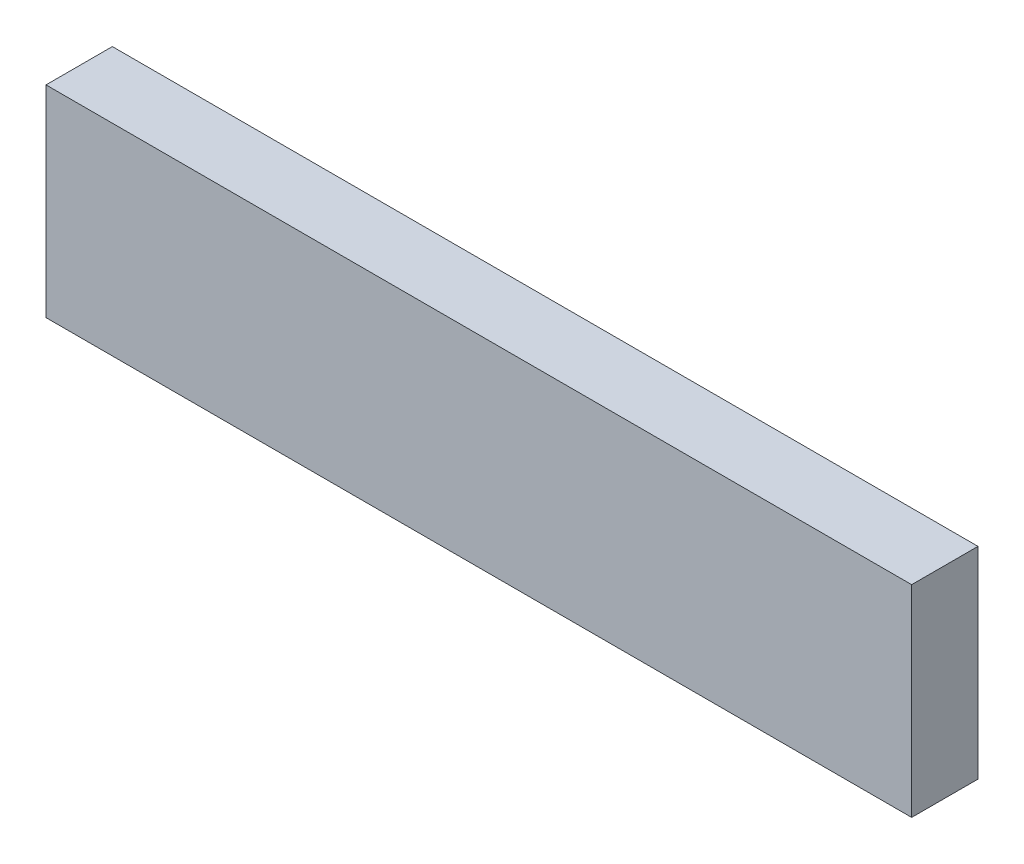
ISO-10303-21;
HEADER;
FILE_DESCRIPTION(('STEP AP214'),'2;1');
FILE_NAME('part.step','',(''),(''),'','','');
FILE_SCHEMA(('AUTOMOTIVE_DESIGN { 1 0 10303 214 1 1 1 1 }'));
ENDSEC;
DATA;
#1=APPLICATION_CONTEXT('core data for automotive mechanical design processes');
#2=APPLICATION_PROTOCOL_DEFINITION('international standard','automotive_design',2000,#1);
#3=PRODUCT_CONTEXT('',#1,'mechanical');
#4=PRODUCT('Part','Part','',(#3));
#5=PRODUCT_RELATED_PRODUCT_CATEGORY('part','',(#4));
#6=PRODUCT_DEFINITION_FORMATION('','',#4);
#7=PRODUCT_DEFINITION_CONTEXT('part definition',#1,'design');
#8=PRODUCT_DEFINITION('design','',#6,#7);
#9=PRODUCT_DEFINITION_SHAPE('','',#8);
#10=(LENGTH_UNIT() NAMED_UNIT(*) SI_UNIT(.MILLI.,.METRE.));
#11=(NAMED_UNIT(*) PLANE_ANGLE_UNIT() SI_UNIT($,.RADIAN.));
#12=(NAMED_UNIT(*) SI_UNIT($,.STERADIAN.) SOLID_ANGLE_UNIT());
#13=UNCERTAINTY_MEASURE_WITH_UNIT(LENGTH_MEASURE(1.E-05),#10,'distance_accuracy_value','');
#14=(GEOMETRIC_REPRESENTATION_CONTEXT(3) GLOBAL_UNCERTAINTY_ASSIGNED_CONTEXT((#13)) GLOBAL_UNIT_ASSIGNED_CONTEXT((#10,
#11,#12)) REPRESENTATION_CONTEXT('',''));
#15=CARTESIAN_POINT('',(0.,0.,0.));
#16=DIRECTION('',(0.,0.,1.));
#17=DIRECTION('',(1.,0.,0.));
#18=AXIS2_PLACEMENT_3D('',#15,#16,#17);
#19=CARTESIAN_POINT('',(65.2365462790918,-15.1923261202123,10.));
#20=DIRECTION('',(-1.,0.,0.));
#21=DIRECTION('',(0.,0.,1.));
#22=AXIS2_PLACEMENT_3D('',#19,#20,#21);
#23=PLANE('',#22);
#24=DIRECTION('',(0.,1.,0.));
#25=VECTOR('',#24,1.);
#26=CARTESIAN_POINT('',(65.2365462790918,-15.1923261202123,0.));
#27=LINE('',#26,#25);
#28=CARTESIAN_POINT('',(65.2365462790918,-15.1923261202123,0.));
#29=VERTEX_POINT('',#28);
#30=CARTESIAN_POINT('',(65.2365462790918,15.1923261202123,0.));
#31=VERTEX_POINT('',#30);
#32=EDGE_CURVE('E111',#29,#31,#27,.T.);
#33=ORIENTED_EDGE('',*,*,#32,.T.);
#34=DIRECTION('',(0.,0.,-1.));
#35=VECTOR('',#34,1.);
#36=CARTESIAN_POINT('',(65.2365462790918,15.1923261202123,10.));
#37=LINE('',#36,#35);
#38=CARTESIAN_POINT('',(65.2365462790918,15.1923261202123,10.));
#39=VERTEX_POINT('',#38);
#40=EDGE_CURVE('E11',#39,#31,#37,.T.);
#41=ORIENTED_EDGE('',*,*,#40,.F.);
#42=DIRECTION('',(0.,1.,0.));
#43=VECTOR('',#42,1.);
#44=CARTESIAN_POINT('',(65.2365462790918,-15.1923261202123,10.));
#45=LINE('',#44,#43);
#46=CARTESIAN_POINT('',(65.2365462790918,-15.1923261202123,10.));
#47=VERTEX_POINT('',#46);
#48=EDGE_CURVE('E98',#47,#39,#45,.T.);
#49=ORIENTED_EDGE('',*,*,#48,.F.);
#50=DIRECTION('',(0.,0.,-1.));
#51=VECTOR('',#50,1.);
#52=CARTESIAN_POINT('',(65.2365462790918,-15.1923261202123,10.));
#53=LINE('',#52,#51);
#54=EDGE_CURVE('E107',#47,#29,#53,.T.);
#55=ORIENTED_EDGE('',*,*,#54,.T.);
#56=EDGE_LOOP('',(#33,#41,#49,#55));
#57=FACE_BOUND('',#56,.T.);
#58=ADVANCED_FACE('F47',(#57),#23,.F.);
#59=CARTESIAN_POINT('',(-65.2365462790918,15.1923261202123,10.));
#60=DIRECTION('',(0.,-1.,0.));
#61=DIRECTION('',(0.,0.,-1.));
#62=AXIS2_PLACEMENT_3D('',#59,#60,#61);
#63=PLANE('',#62);
#64=DIRECTION('',(-1.,0.,0.));
#65=VECTOR('',#64,1.);
#66=CARTESIAN_POINT('',(-65.2365462790918,15.1923261202123,0.));
#67=LINE('',#66,#65);
#68=CARTESIAN_POINT('',(-65.2365462790918,15.1923261202123,0.));
#69=VERTEX_POINT('',#68);
#70=EDGE_CURVE('E102',#31,#69,#67,.T.);
#71=ORIENTED_EDGE('',*,*,#70,.T.);
#72=DIRECTION('',(0.,0.,-1.));
#73=VECTOR('',#72,1.);
#74=CARTESIAN_POINT('',(-65.2365462790918,15.1923261202123,10.));
#75=LINE('',#74,#73);
#76=CARTESIAN_POINT('',(-65.2365462790918,15.1923261202123,10.));
#77=VERTEX_POINT('',#76);
#78=EDGE_CURVE('E55',#77,#69,#75,.T.);
#79=ORIENTED_EDGE('',*,*,#78,.F.);
#80=DIRECTION('',(-1.,0.,0.));
#81=VECTOR('',#80,1.);
#82=CARTESIAN_POINT('',(-65.2365462790918,15.1923261202123,10.));
#83=LINE('',#82,#81);
#84=EDGE_CURVE('E93',#39,#77,#83,.T.);
#85=ORIENTED_EDGE('',*,*,#84,.F.);
#86=ORIENTED_EDGE('',*,*,#40,.T.);
#87=EDGE_LOOP('',(#71,#79,#85,#86));
#88=FACE_BOUND('',#87,.T.);
#89=ADVANCED_FACE('F101',(#88),#63,.F.);
#90=CARTESIAN_POINT('',(-65.2365462790918,-15.1923261202123,10.));
#91=DIRECTION('',(1.,0.,0.));
#92=DIRECTION('',(0.,0.,-1.));
#93=AXIS2_PLACEMENT_3D('',#90,#91,#92);
#94=PLANE('',#93);
#95=DIRECTION('',(0.,-1.,0.));
#96=VECTOR('',#95,1.);
#97=CARTESIAN_POINT('',(-65.2365462790918,-15.1923261202123,0.));
#98=LINE('',#97,#96);
#99=CARTESIAN_POINT('',(-65.2365462790918,-15.1923261202123,0.));
#100=VERTEX_POINT('',#99);
#101=EDGE_CURVE('E80',#69,#100,#98,.T.);
#102=ORIENTED_EDGE('',*,*,#101,.T.);
#103=DIRECTION('',(0.,0.,-1.));
#104=VECTOR('',#103,1.);
#105=CARTESIAN_POINT('',(-65.2365462790918,-15.1923261202123,10.));
#106=LINE('',#105,#104);
#107=CARTESIAN_POINT('',(-65.2365462790918,-15.1923261202123,10.));
#108=VERTEX_POINT('',#107);
#109=EDGE_CURVE('E103',#108,#100,#106,.T.);
#110=ORIENTED_EDGE('',*,*,#109,.F.);
#111=DIRECTION('',(0.,-1.,0.));
#112=VECTOR('',#111,1.);
#113=CARTESIAN_POINT('',(-65.2365462790918,-15.1923261202123,10.));
#114=LINE('',#113,#112);
#115=EDGE_CURVE('E96',#77,#108,#114,.T.);
#116=ORIENTED_EDGE('',*,*,#115,.F.);
#117=ORIENTED_EDGE('',*,*,#78,.T.);
#118=EDGE_LOOP('',(#102,#110,#116,#117));
#119=FACE_BOUND('',#118,.T.);
#120=ADVANCED_FACE('F104',(#119),#94,.F.);
#121=CARTESIAN_POINT('',(-65.2365462790918,-15.1923261202123,10.));
#122=DIRECTION('',(0.,1.,0.));
#123=DIRECTION('',(0.,0.,1.));
#124=AXIS2_PLACEMENT_3D('',#121,#122,#123);
#125=PLANE('',#124);
#126=DIRECTION('',(1.,0.,0.));
#127=VECTOR('',#126,1.);
#128=CARTESIAN_POINT('',(-65.2365462790918,-15.1923261202123,0.));
#129=LINE('',#128,#127);
#130=EDGE_CURVE('E86',#100,#29,#129,.T.);
#131=ORIENTED_EDGE('',*,*,#130,.T.);
#132=ORIENTED_EDGE('',*,*,#54,.F.);
#133=DIRECTION('',(1.,0.,0.));
#134=VECTOR('',#133,1.);
#135=CARTESIAN_POINT('',(-65.2365462790918,-15.1923261202123,10.));
#136=LINE('',#135,#134);
#137=EDGE_CURVE('E63',#108,#47,#136,.T.);
#138=ORIENTED_EDGE('',*,*,#137,.F.);
#139=ORIENTED_EDGE('',*,*,#109,.T.);
#140=EDGE_LOOP('',(#131,#132,#138,#139));
#141=FACE_BOUND('',#140,.T.);
#142=ADVANCED_FACE('F119',(#141),#125,.F.);
#143=CARTESIAN_POINT('',(0.,0.,10.));
#144=DIRECTION('',(0.,0.,-1.));
#145=DIRECTION('',(-1.,0.,0.));
#146=AXIS2_PLACEMENT_3D('',#143,#144,#145);
#147=PLANE('',#146);
#148=ORIENTED_EDGE('',*,*,#48,.T.);
#149=ORIENTED_EDGE('',*,*,#84,.T.);
#150=ORIENTED_EDGE('',*,*,#115,.T.);
#151=ORIENTED_EDGE('',*,*,#137,.T.);
#152=EDGE_LOOP('',(#148,#149,#150,#151));
#153=FACE_BOUND('',#152,.T.);
#154=ADVANCED_FACE('F94',(#153),#147,.F.);
#155=CARTESIAN_POINT('',(0.,0.,0.));
#156=DIRECTION('',(0.,0.,-1.));
#157=DIRECTION('',(-1.,0.,0.));
#158=AXIS2_PLACEMENT_3D('',#155,#156,#157);
#159=PLANE('',#158);
#160=ORIENTED_EDGE('',*,*,#32,.F.);
#161=ORIENTED_EDGE('',*,*,#130,.F.);
#162=ORIENTED_EDGE('',*,*,#101,.F.);
#163=ORIENTED_EDGE('',*,*,#70,.F.);
#164=EDGE_LOOP('',(#160,#161,#162,#163));
#165=FACE_BOUND('',#164,.T.);
#166=ADVANCED_FACE('F122',(#165),#159,.T.);
#167=CLOSED_SHELL('',(#58,#89,#120,#142,#154,#166));
#168=MANIFOLD_SOLID_BREP('B2',#167);
#169=ADVANCED_BREP_SHAPE_REPRESENTATION('',(#18,#168),#14);
#170=SHAPE_DEFINITION_REPRESENTATION(#9,#169);
ENDSEC;
END-ISO-10303-21;
